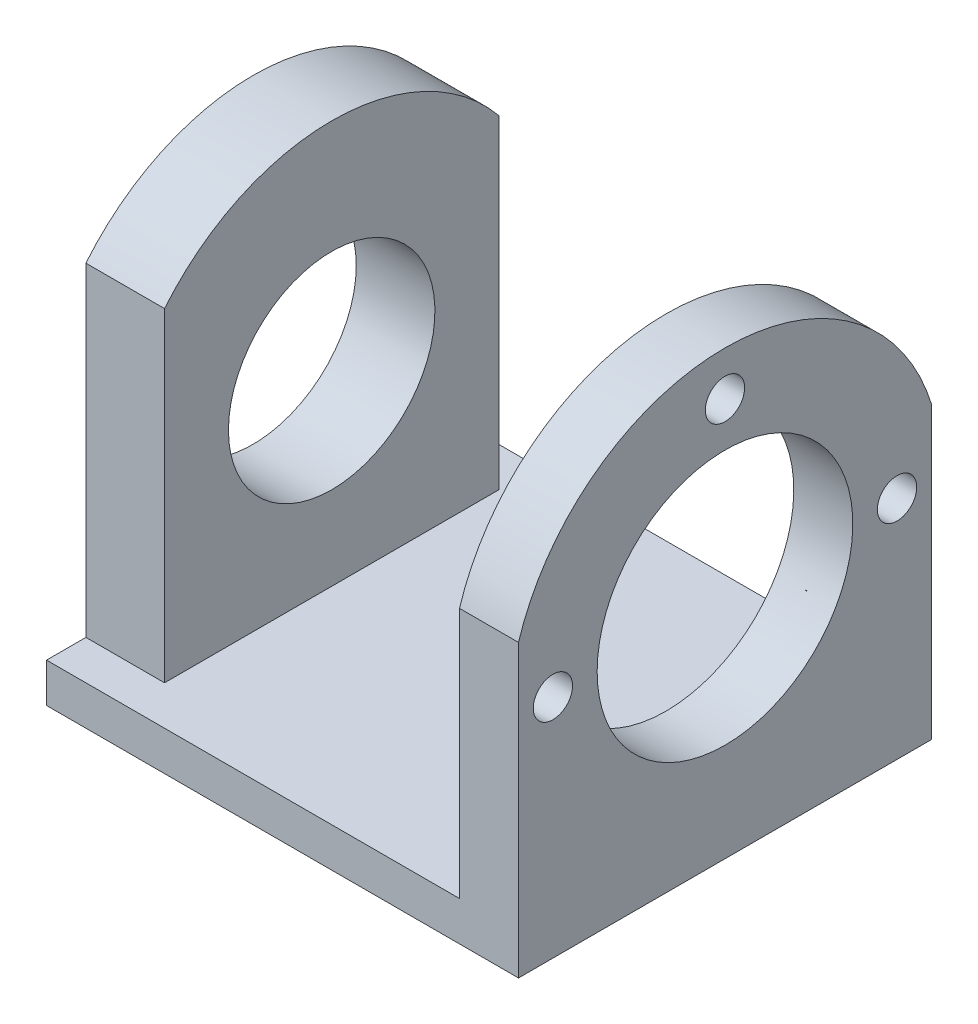
ISO-10303-21;
HEADER;
FILE_DESCRIPTION(('STEP AP214'),'2;1');
FILE_NAME('part.step','',(''),(''),'','','');
FILE_SCHEMA(('AUTOMOTIVE_DESIGN { 1 0 10303 214 1 1 1 1 }'));
ENDSEC;
DATA;
#1=APPLICATION_CONTEXT('core data for automotive mechanical design processes');
#2=APPLICATION_PROTOCOL_DEFINITION('international standard','automotive_design',2000,#1);
#3=PRODUCT_CONTEXT('',#1,'mechanical');
#4=PRODUCT('Part','Part','',(#3));
#5=PRODUCT_RELATED_PRODUCT_CATEGORY('part','',(#4));
#6=PRODUCT_DEFINITION_FORMATION('','',#4);
#7=PRODUCT_DEFINITION_CONTEXT('part definition',#1,'design');
#8=PRODUCT_DEFINITION('design','',#6,#7);
#9=PRODUCT_DEFINITION_SHAPE('','',#8);
#10=(LENGTH_UNIT() NAMED_UNIT(*) SI_UNIT(.MILLI.,.METRE.));
#11=(NAMED_UNIT(*) PLANE_ANGLE_UNIT() SI_UNIT($,.RADIAN.));
#12=(NAMED_UNIT(*) SI_UNIT($,.STERADIAN.) SOLID_ANGLE_UNIT());
#13=UNCERTAINTY_MEASURE_WITH_UNIT(LENGTH_MEASURE(1.E-05),#10,'distance_accuracy_value','');
#14=(GEOMETRIC_REPRESENTATION_CONTEXT(3) GLOBAL_UNCERTAINTY_ASSIGNED_CONTEXT((#13)) GLOBAL_UNIT_ASSIGNED_CONTEXT((#10,
#11,#12)) REPRESENTATION_CONTEXT('',''));
#15=CARTESIAN_POINT('',(0.,0.,0.));
#16=DIRECTION('',(0.,0.,1.));
#17=DIRECTION('',(1.,0.,0.));
#18=AXIS2_PLACEMENT_3D('',#15,#16,#17);
#19=CARTESIAN_POINT('',(24.,45.,-21.));
#20=DIRECTION('',(-1.,0.,0.));
#21=DIRECTION('',(0.,0.,1.));
#22=AXIS2_PLACEMENT_3D('',#19,#20,#21);
#23=PLANE('',#22);
#24=CARTESIAN_POINT('',(24.,23.,17.5));
#25=DIRECTION('',(1.,0.,0.));
#26=DIRECTION('',(0.,0.,-1.));
#27=AXIS2_PLACEMENT_3D('',#24,#25,#26);
#28=CIRCLE('',#27,2.);
#29=CARTESIAN_POINT('',(24.,23.,15.5));
#30=VERTEX_POINT('',#29);
#31=EDGE_CURVE('E248',#30,#30,#28,.T.);
#32=ORIENTED_EDGE('',*,*,#31,.F.);
#33=EDGE_LOOP('',(#32));
#34=FACE_BOUND('',#33,.T.);
#35=CARTESIAN_POINT('',(24.,40.5,0.));
#36=DIRECTION('',(1.,0.,0.));
#37=DIRECTION('',(0.,0.,-1.));
#38=AXIS2_PLACEMENT_3D('',#35,#36,#37);
#39=CIRCLE('',#38,2.);
#40=CARTESIAN_POINT('',(24.,40.5,-2.));
#41=VERTEX_POINT('',#40);
#42=EDGE_CURVE('E249',#41,#41,#39,.T.);
#43=ORIENTED_EDGE('',*,*,#42,.F.);
#44=EDGE_LOOP('',(#43));
#45=FACE_BOUND('',#44,.T.);
#46=CARTESIAN_POINT('',(24.,23.,-17.5));
#47=DIRECTION('',(1.,0.,0.));
#48=DIRECTION('',(0.,0.,-1.));
#49=AXIS2_PLACEMENT_3D('',#46,#47,#48);
#50=CIRCLE('',#49,2.);
#51=CARTESIAN_POINT('',(24.,23.,-19.5));
#52=VERTEX_POINT('',#51);
#53=EDGE_CURVE('E242',#52,#52,#50,.T.);
#54=ORIENTED_EDGE('',*,*,#53,.F.);
#55=EDGE_LOOP('',(#54));
#56=FACE_BOUND('',#55,.T.);
#57=CARTESIAN_POINT('',(24.,23.,0.));
#58=DIRECTION('',(-1.,0.,0.));
#59=DIRECTION('',(0.,0.,1.));
#60=AXIS2_PLACEMENT_3D('',#57,#58,#59);
#61=CIRCLE('',#60,13.);
#62=CARTESIAN_POINT('',(24.,23.,13.));
#63=VERTEX_POINT('',#62);
#64=EDGE_CURVE('E236',#63,#63,#61,.F.);
#65=ORIENTED_EDGE('',*,*,#64,.F.);
#66=EDGE_LOOP('',(#65));
#67=FACE_BOUND('',#66,.T.);
#68=DIRECTION('',(0.,-1.,0.));
#69=VECTOR('',#68,1.);
#70=CARTESIAN_POINT('',(24.,45.,-21.));
#71=LINE('',#70,#69);
#72=CARTESIAN_POINT('',(24.,29.557438524302,-21.));
#73=VERTEX_POINT('',#72);
#74=CARTESIAN_POINT('',(24.,0.,-21.));
#75=VERTEX_POINT('',#74);
#76=EDGE_CURVE('E193',#73,#75,#71,.T.);
#77=ORIENTED_EDGE('',*,*,#76,.F.);
#78=CARTESIAN_POINT('',(24.,23.,0.));
#79=DIRECTION('',(-1.,0.,0.));
#80=DIRECTION('',(0.,0.,1.));
#81=AXIS2_PLACEMENT_3D('',#78,#79,#80);
#82=CIRCLE('',#81,22.);
#83=CARTESIAN_POINT('',(24.,29.557438524302,21.));
#84=VERTEX_POINT('',#83);
#85=EDGE_CURVE('E265',#84,#73,#82,.T.);
#86=ORIENTED_EDGE('',*,*,#85,.F.);
#87=DIRECTION('',(0.,-1.,0.));
#88=VECTOR('',#87,1.);
#89=CARTESIAN_POINT('',(24.,45.,21.));
#90=LINE('',#89,#88);
#91=CARTESIAN_POINT('',(24.,0.,21.));
#92=VERTEX_POINT('',#91);
#93=EDGE_CURVE('E199',#84,#92,#90,.T.);
#94=ORIENTED_EDGE('',*,*,#93,.T.);
#95=DIRECTION('',(0.,0.,-1.));
#96=VECTOR('',#95,1.);
#97=CARTESIAN_POINT('',(24.,0.,-21.));
#98=LINE('',#97,#96);
#99=EDGE_CURVE('E210',#92,#75,#98,.T.);
#100=ORIENTED_EDGE('',*,*,#99,.T.);
#101=EDGE_LOOP('',(#77,#86,#94,#100));
#102=FACE_BOUND('',#101,.T.);
#103=ADVANCED_FACE('F40',(#34,#45,#56,#67,#102),#23,.F.);
#104=CARTESIAN_POINT('',(-24.,45.,-21.));
#105=DIRECTION('',(1.,0.,0.));
#106=DIRECTION('',(0.,0.,-1.));
#107=AXIS2_PLACEMENT_3D('',#104,#105,#106);
#108=PLANE('',#107);
#109=CARTESIAN_POINT('',(-24.,23.,0.));
#110=DIRECTION('',(-1.,0.,0.));
#111=DIRECTION('',(0.,0.,1.));
#112=AXIS2_PLACEMENT_3D('',#109,#110,#111);
#113=CIRCLE('',#112,10.5);
#114=CARTESIAN_POINT('',(-24.,23.,10.5));
#115=VERTEX_POINT('',#114);
#116=EDGE_CURVE('E233',#115,#115,#113,.T.);
#117=ORIENTED_EDGE('',*,*,#116,.F.);
#118=EDGE_LOOP('',(#117));
#119=FACE_BOUND('',#118,.T.);
#120=DIRECTION('',(0.,-1.,0.));
#121=VECTOR('',#120,1.);
#122=CARTESIAN_POINT('',(-24.,45.,21.));
#123=LINE('',#122,#121);
#124=CARTESIAN_POINT('',(-24.,4.,21.));
#125=VERTEX_POINT('',#124);
#126=CARTESIAN_POINT('',(-24.,0.,21.));
#127=VERTEX_POINT('',#126);
#128=EDGE_CURVE('E197',#125,#127,#123,.T.);
#129=ORIENTED_EDGE('',*,*,#128,.F.);
#130=DIRECTION('',(0.,0.,1.));
#131=VECTOR('',#130,1.);
#132=CARTESIAN_POINT('',(-24.,4.,17.));
#133=LINE('',#132,#131);
#134=CARTESIAN_POINT('',(-24.,4.,17.));
#135=VERTEX_POINT('',#134);
#136=EDGE_CURVE('E295',#135,#125,#133,.T.);
#137=ORIENTED_EDGE('',*,*,#136,.F.);
#138=DIRECTION('',(0.,-1.,0.));
#139=VECTOR('',#138,1.);
#140=CARTESIAN_POINT('',(-24.,36.9642400437689,17.));
#141=LINE('',#140,#139);
#142=CARTESIAN_POINT('',(-24.,36.9642400437689,17.));
#143=VERTEX_POINT('',#142);
#144=EDGE_CURVE('E292',#143,#135,#141,.T.);
#145=ORIENTED_EDGE('',*,*,#144,.F.);
#146=CARTESIAN_POINT('',(-24.,23.,0.));
#147=DIRECTION('',(-1.,0.,0.));
#148=DIRECTION('',(0.,0.,1.));
#149=AXIS2_PLACEMENT_3D('',#146,#147,#148);
#150=CIRCLE('',#149,22.);
#151=CARTESIAN_POINT('',(-24.,36.9642400437689,-17.));
#152=VERTEX_POINT('',#151);
#153=EDGE_CURVE('E266',#143,#152,#150,.T.);
#154=ORIENTED_EDGE('',*,*,#153,.T.);
#155=DIRECTION('',(0.,1.,0.));
#156=VECTOR('',#155,1.);
#157=CARTESIAN_POINT('',(-24.,36.9642400437689,-17.));
#158=LINE('',#157,#156);
#159=CARTESIAN_POINT('',(-24.,4.,-17.));
#160=VERTEX_POINT('',#159);
#161=EDGE_CURVE('E272',#160,#152,#158,.T.);
#162=ORIENTED_EDGE('',*,*,#161,.F.);
#163=DIRECTION('',(0.,0.,1.));
#164=VECTOR('',#163,1.);
#165=CARTESIAN_POINT('',(-24.,4.,-17.));
#166=LINE('',#165,#164);
#167=CARTESIAN_POINT('',(-24.,4.,-21.));
#168=VERTEX_POINT('',#167);
#169=EDGE_CURVE('E275',#168,#160,#166,.T.);
#170=ORIENTED_EDGE('',*,*,#169,.F.);
#171=DIRECTION('',(0.,-1.,0.));
#172=VECTOR('',#171,1.);
#173=CARTESIAN_POINT('',(-24.,45.,-21.));
#174=LINE('',#173,#172);
#175=CARTESIAN_POINT('',(-24.,0.,-21.));
#176=VERTEX_POINT('',#175);
#177=EDGE_CURVE('E195',#168,#176,#174,.T.);
#178=ORIENTED_EDGE('',*,*,#177,.T.);
#179=DIRECTION('',(0.,0.,1.));
#180=VECTOR('',#179,1.);
#181=CARTESIAN_POINT('',(-24.,0.,-21.));
#182=LINE('',#181,#180);
#183=EDGE_CURVE('E204',#176,#127,#182,.T.);
#184=ORIENTED_EDGE('',*,*,#183,.T.);
#185=EDGE_LOOP('',(#129,#137,#145,#154,#162,#170,#178,#184));
#186=FACE_BOUND('',#185,.T.);
#187=ADVANCED_FACE('F341',(#119,#186),#108,.F.);
#188=CARTESIAN_POINT('',(-16.,45.,-21.));
#189=DIRECTION('',(-1.,0.,0.));
#190=DIRECTION('',(0.,-1.,0.));
#191=AXIS2_PLACEMENT_3D('',#188,#189,#190);
#192=PLANE('',#191);
#193=CARTESIAN_POINT('',(-16.,23.,0.));
#194=DIRECTION('',(-1.,0.,0.));
#195=DIRECTION('',(0.,-1.,0.));
#196=AXIS2_PLACEMENT_3D('',#193,#194,#195);
#197=CIRCLE('',#196,10.5);
#198=CARTESIAN_POINT('',(-16.,12.5,0.));
#199=VERTEX_POINT('',#198);
#200=EDGE_CURVE('E230',#199,#199,#197,.F.);
#201=ORIENTED_EDGE('',*,*,#200,.F.);
#202=EDGE_LOOP('',(#201));
#203=FACE_BOUND('',#202,.T.);
#204=CARTESIAN_POINT('',(-16.,23.,0.));
#205=DIRECTION('',(-1.,0.,0.));
#206=DIRECTION('',(0.,-1.,0.));
#207=AXIS2_PLACEMENT_3D('',#204,#205,#206);
#208=CIRCLE('',#207,22.);
#209=CARTESIAN_POINT('',(-16.,36.9642400437689,17.));
#210=VERTEX_POINT('',#209);
#211=CARTESIAN_POINT('',(-16.,36.9642400437689,-17.));
#212=VERTEX_POINT('',#211);
#213=EDGE_CURVE('E256',#210,#212,#208,.T.);
#214=ORIENTED_EDGE('',*,*,#213,.F.);
#215=DIRECTION('',(0.,1.,0.));
#216=VECTOR('',#215,1.);
#217=CARTESIAN_POINT('',(-16.,36.9642400437689,17.));
#218=LINE('',#217,#216);
#219=CARTESIAN_POINT('',(-16.,4.,17.));
#220=VERTEX_POINT('',#219);
#221=EDGE_CURVE('E282',#220,#210,#218,.T.);
#222=ORIENTED_EDGE('',*,*,#221,.F.);
#223=DIRECTION('',(0.,0.,1.));
#224=VECTOR('',#223,1.);
#225=CARTESIAN_POINT('',(-16.,4.,-21.));
#226=LINE('',#225,#224);
#227=CARTESIAN_POINT('',(-16.,4.,-17.));
#228=VERTEX_POINT('',#227);
#229=EDGE_CURVE('E214',#228,#220,#226,.T.);
#230=ORIENTED_EDGE('',*,*,#229,.F.);
#231=DIRECTION('',(0.,-1.,0.));
#232=VECTOR('',#231,1.);
#233=CARTESIAN_POINT('',(-16.,36.9642400437689,-17.));
#234=LINE('',#233,#232);
#235=EDGE_CURVE('E279',#212,#228,#234,.T.);
#236=ORIENTED_EDGE('',*,*,#235,.F.);
#237=EDGE_LOOP('',(#214,#222,#230,#236));
#238=FACE_BOUND('',#237,.T.);
#239=ADVANCED_FACE('F367',(#203,#238),#192,.F.);
#240=CARTESIAN_POINT('',(18.,45.,-21.));
#241=DIRECTION('',(1.,0.,0.));
#242=DIRECTION('',(0.,1.,0.));
#243=AXIS2_PLACEMENT_3D('',#240,#241,#242);
#244=PLANE('',#243);
#245=CARTESIAN_POINT('',(18.,23.,17.5));
#246=DIRECTION('',(1.,0.,0.));
#247=DIRECTION('',(0.,1.,0.));
#248=AXIS2_PLACEMENT_3D('',#245,#246,#247);
#249=CIRCLE('',#248,2.);
#250=CARTESIAN_POINT('',(18.,25.,17.5));
#251=VERTEX_POINT('',#250);
#252=EDGE_CURVE('E252',#251,#251,#249,.F.);
#253=ORIENTED_EDGE('',*,*,#252,.F.);
#254=EDGE_LOOP('',(#253));
#255=FACE_BOUND('',#254,.T.);
#256=CARTESIAN_POINT('',(18.,40.5,0.));
#257=DIRECTION('',(1.,0.,0.));
#258=DIRECTION('',(0.,1.,0.));
#259=AXIS2_PLACEMENT_3D('',#256,#257,#258);
#260=CIRCLE('',#259,2.);
#261=CARTESIAN_POINT('',(18.,42.5,0.));
#262=VERTEX_POINT('',#261);
#263=EDGE_CURVE('E253',#262,#262,#260,.F.);
#264=ORIENTED_EDGE('',*,*,#263,.F.);
#265=EDGE_LOOP('',(#264));
#266=FACE_BOUND('',#265,.T.);
#267=CARTESIAN_POINT('',(18.,23.,-17.5));
#268=DIRECTION('',(1.,0.,0.));
#269=DIRECTION('',(0.,1.,0.));
#270=AXIS2_PLACEMENT_3D('',#267,#268,#269);
#271=CIRCLE('',#270,2.);
#272=CARTESIAN_POINT('',(18.,25.,-17.5));
#273=VERTEX_POINT('',#272);
#274=EDGE_CURVE('E245',#273,#273,#271,.F.);
#275=ORIENTED_EDGE('',*,*,#274,.F.);
#276=EDGE_LOOP('',(#275));
#277=FACE_BOUND('',#276,.T.);
#278=CARTESIAN_POINT('',(18.,23.,0.));
#279=DIRECTION('',(-1.,0.,0.));
#280=DIRECTION('',(0.,-1.,0.));
#281=AXIS2_PLACEMENT_3D('',#278,#279,#280);
#282=CIRCLE('',#281,13.);
#283=CARTESIAN_POINT('',(18.,10.,0.));
#284=VERTEX_POINT('',#283);
#285=EDGE_CURVE('E239',#284,#284,#282,.T.);
#286=ORIENTED_EDGE('',*,*,#285,.F.);
#287=EDGE_LOOP('',(#286));
#288=FACE_BOUND('',#287,.T.);
#289=CARTESIAN_POINT('',(18.,23.,0.));
#290=DIRECTION('',(1.,0.,0.));
#291=DIRECTION('',(0.,1.,0.));
#292=AXIS2_PLACEMENT_3D('',#289,#290,#291);
#293=CIRCLE('',#292,22.);
#294=CARTESIAN_POINT('',(18.,29.557438524302,-21.));
#295=VERTEX_POINT('',#294);
#296=CARTESIAN_POINT('',(18.,29.557438524302,21.));
#297=VERTEX_POINT('',#296);
#298=EDGE_CURVE('E191',#295,#297,#293,.T.);
#299=ORIENTED_EDGE('',*,*,#298,.F.);
#300=DIRECTION('',(0.,1.,0.));
#301=VECTOR('',#300,1.);
#302=CARTESIAN_POINT('',(18.,45.,-21.));
#303=LINE('',#302,#301);
#304=CARTESIAN_POINT('',(18.,4.,-21.));
#305=VERTEX_POINT('',#304);
#306=EDGE_CURVE('E217',#305,#295,#303,.T.);
#307=ORIENTED_EDGE('',*,*,#306,.F.);
#308=DIRECTION('',(0.,0.,1.));
#309=VECTOR('',#308,1.);
#310=CARTESIAN_POINT('',(18.,4.,-21.));
#311=LINE('',#310,#309);
#312=CARTESIAN_POINT('',(18.,4.,21.));
#313=VERTEX_POINT('',#312);
#314=EDGE_CURVE('E213',#305,#313,#311,.T.);
#315=ORIENTED_EDGE('',*,*,#314,.T.);
#316=DIRECTION('',(0.,1.,0.));
#317=VECTOR('',#316,1.);
#318=CARTESIAN_POINT('',(18.,45.,21.));
#319=LINE('',#318,#317);
#320=EDGE_CURVE('E224',#313,#297,#319,.T.);
#321=ORIENTED_EDGE('',*,*,#320,.T.);
#322=EDGE_LOOP('',(#299,#307,#315,#321));
#323=FACE_BOUND('',#322,.T.);
#324=ADVANCED_FACE('F352',(#255,#266,#277,#288,#323),#244,.F.);
#325=CARTESIAN_POINT('',(-24.,45.,-21.));
#326=DIRECTION('',(0.,0.,1.));
#327=DIRECTION('',(1.,0.,0.));
#328=AXIS2_PLACEMENT_3D('',#325,#326,#327);
#329=PLANE('',#328);
#330=ORIENTED_EDGE('',*,*,#177,.F.);
#331=DIRECTION('',(1.,0.,0.));
#332=VECTOR('',#331,1.);
#333=CARTESIAN_POINT('',(-16.,4.,-21.));
#334=LINE('',#333,#332);
#335=EDGE_CURVE('E221',#168,#305,#334,.T.);
#336=ORIENTED_EDGE('',*,*,#335,.T.);
#337=ORIENTED_EDGE('',*,*,#306,.T.);
#338=DIRECTION('',(-1.,0.,0.));
#339=VECTOR('',#338,1.);
#340=CARTESIAN_POINT('',(24.,29.557438524302,-21.));
#341=LINE('',#340,#339);
#342=EDGE_CURVE('E268',#73,#295,#341,.T.);
#343=ORIENTED_EDGE('',*,*,#342,.F.);
#344=ORIENTED_EDGE('',*,*,#76,.T.);
#345=DIRECTION('',(-1.,0.,0.));
#346=VECTOR('',#345,1.);
#347=CARTESIAN_POINT('',(-24.,0.,-21.));
#348=LINE('',#347,#346);
#349=EDGE_CURVE('E207',#75,#176,#348,.T.);
#350=ORIENTED_EDGE('',*,*,#349,.T.);
#351=EDGE_LOOP('',(#330,#336,#337,#343,#344,#350));
#352=FACE_BOUND('',#351,.T.);
#353=ADVANCED_FACE('F346',(#352),#329,.F.);
#354=CARTESIAN_POINT('',(-24.,45.,21.));
#355=DIRECTION('',(0.,0.,-1.));
#356=DIRECTION('',(-1.,0.,0.));
#357=AXIS2_PLACEMENT_3D('',#354,#355,#356);
#358=PLANE('',#357);
#359=DIRECTION('',(1.,0.,0.));
#360=VECTOR('',#359,1.);
#361=CARTESIAN_POINT('',(-16.,4.,21.));
#362=LINE('',#361,#360);
#363=EDGE_CURVE('E227',#125,#313,#362,.T.);
#364=ORIENTED_EDGE('',*,*,#363,.F.);
#365=ORIENTED_EDGE('',*,*,#128,.T.);
#366=DIRECTION('',(1.,0.,0.));
#367=VECTOR('',#366,1.);
#368=CARTESIAN_POINT('',(-24.,0.,21.));
#369=LINE('',#368,#367);
#370=EDGE_CURVE('E201',#127,#92,#369,.T.);
#371=ORIENTED_EDGE('',*,*,#370,.T.);
#372=ORIENTED_EDGE('',*,*,#93,.F.);
#373=DIRECTION('',(-1.,0.,0.));
#374=VECTOR('',#373,1.);
#375=CARTESIAN_POINT('',(24.,29.557438524302,21.));
#376=LINE('',#375,#374);
#377=EDGE_CURVE('E262',#84,#297,#376,.T.);
#378=ORIENTED_EDGE('',*,*,#377,.T.);
#379=ORIENTED_EDGE('',*,*,#320,.F.);
#380=EDGE_LOOP('',(#364,#365,#371,#372,#378,#379));
#381=FACE_BOUND('',#380,.T.);
#382=ADVANCED_FACE('F320',(#381),#358,.F.);
#383=CARTESIAN_POINT('',(0.,0.,0.));
#384=DIRECTION('',(0.,1.,0.));
#385=DIRECTION('',(0.,0.,1.));
#386=AXIS2_PLACEMENT_3D('',#383,#384,#385);
#387=PLANE('',#386);
#388=CARTESIAN_POINT('',(21.,0.,-12.5));
#389=DIRECTION('',(0.,-1.,0.));
#390=DIRECTION('',(0.,0.,-1.));
#391=AXIS2_PLACEMENT_3D('',#388,#389,#390);
#392=CIRCLE('',#391,1.24999999999999);
#393=CARTESIAN_POINT('',(21.,0.,-13.75));
#394=VERTEX_POINT('',#393);
#395=EDGE_CURVE('E151',#394,#394,#392,.T.);
#396=ORIENTED_EDGE('',*,*,#395,.F.);
#397=EDGE_LOOP('',(#396));
#398=FACE_BOUND('',#397,.T.);
#399=CARTESIAN_POINT('',(21.,0.,12.5));
#400=DIRECTION('',(0.,-1.,0.));
#401=DIRECTION('',(0.,0.,-1.));
#402=AXIS2_PLACEMENT_3D('',#399,#400,#401);
#403=CIRCLE('',#402,1.24999999999999);
#404=CARTESIAN_POINT('',(21.,0.,11.25));
#405=VERTEX_POINT('',#404);
#406=EDGE_CURVE('E150',#405,#405,#403,.T.);
#407=ORIENTED_EDGE('',*,*,#406,.F.);
#408=EDGE_LOOP('',(#407));
#409=FACE_BOUND('',#408,.T.);
#410=CARTESIAN_POINT('',(-21.,0.,12.5));
#411=DIRECTION('',(0.,-1.,0.));
#412=DIRECTION('',(0.,0.,-1.));
#413=AXIS2_PLACEMENT_3D('',#410,#411,#412);
#414=CIRCLE('',#413,1.24999999999999);
#415=CARTESIAN_POINT('',(-21.,0.,11.25));
#416=VERTEX_POINT('',#415);
#417=EDGE_CURVE('E307',#416,#416,#414,.T.);
#418=ORIENTED_EDGE('',*,*,#417,.F.);
#419=EDGE_LOOP('',(#418));
#420=FACE_BOUND('',#419,.T.);
#421=CARTESIAN_POINT('',(-21.,0.,-12.5));
#422=DIRECTION('',(0.,-1.,0.));
#423=DIRECTION('',(0.,0.,-1.));
#424=AXIS2_PLACEMENT_3D('',#421,#422,#423);
#425=CIRCLE('',#424,1.24999999999999);
#426=CARTESIAN_POINT('',(-21.,0.,-13.75));
#427=VERTEX_POINT('',#426);
#428=EDGE_CURVE('E301',#427,#427,#425,.T.);
#429=ORIENTED_EDGE('',*,*,#428,.F.);
#430=EDGE_LOOP('',(#429));
#431=FACE_BOUND('',#430,.T.);
#432=ORIENTED_EDGE('',*,*,#99,.F.);
#433=ORIENTED_EDGE('',*,*,#370,.F.);
#434=ORIENTED_EDGE('',*,*,#183,.F.);
#435=ORIENTED_EDGE('',*,*,#349,.F.);
#436=EDGE_LOOP('',(#432,#433,#434,#435));
#437=FACE_BOUND('',#436,.T.);
#438=ADVANCED_FACE('F316',(#398,#409,#420,#431,#437),#387,.F.);
#439=CARTESIAN_POINT('',(-16.,4.,-21.));
#440=DIRECTION('',(0.,-1.,0.));
#441=DIRECTION('',(0.,0.,-1.));
#442=AXIS2_PLACEMENT_3D('',#439,#440,#441);
#443=PLANE('',#442);
#444=ORIENTED_EDGE('',*,*,#314,.F.);
#445=ORIENTED_EDGE('',*,*,#335,.F.);
#446=ORIENTED_EDGE('',*,*,#169,.T.);
#447=DIRECTION('',(-1.,0.,0.));
#448=VECTOR('',#447,1.);
#449=CARTESIAN_POINT('',(24.001,4.,-17.));
#450=LINE('',#449,#448);
#451=EDGE_CURVE('E273',#228,#160,#450,.T.);
#452=ORIENTED_EDGE('',*,*,#451,.F.);
#453=ORIENTED_EDGE('',*,*,#229,.T.);
#454=DIRECTION('',(-1.,0.,0.));
#455=VECTOR('',#454,1.);
#456=CARTESIAN_POINT('',(24.001,4.,17.));
#457=LINE('',#456,#455);
#458=EDGE_CURVE('E289',#220,#135,#457,.T.);
#459=ORIENTED_EDGE('',*,*,#458,.T.);
#460=ORIENTED_EDGE('',*,*,#136,.T.);
#461=ORIENTED_EDGE('',*,*,#363,.T.);
#462=EDGE_LOOP('',(#444,#445,#446,#452,#453,#459,#460,#461));
#463=FACE_BOUND('',#462,.T.);
#464=ADVANCED_FACE('F319',(#463),#443,.F.);
#465=CARTESIAN_POINT('',(24.001,23.,0.));
#466=DIRECTION('',(-1.,0.,0.));
#467=DIRECTION('',(0.,0.,1.));
#468=AXIS2_PLACEMENT_3D('',#465,#466,#467);
#469=CYLINDRICAL_SURFACE('',#468,10.5);
#470=ORIENTED_EDGE('',*,*,#116,.T.);
#471=EDGE_LOOP('',(#470));
#472=FACE_BOUND('',#471,.T.);
#473=ORIENTED_EDGE('',*,*,#200,.T.);
#474=EDGE_LOOP('',(#473));
#475=FACE_BOUND('',#474,.T.);
#476=ADVANCED_FACE('F398',(#472,#475),#469,.F.);
#477=CARTESIAN_POINT('',(24.001,23.,0.));
#478=DIRECTION('',(-1.,0.,0.));
#479=DIRECTION('',(0.,-1.,0.));
#480=AXIS2_PLACEMENT_3D('',#477,#478,#479);
#481=CYLINDRICAL_SURFACE('',#480,13.);
#482=CARTESIAN_POINT('',(21.1440702257322,16.5,-11.2583302491977));
#483=CARTESIAN_POINT('',(21.1264449353295,16.4964572733055,-11.2562847387527));
#484=CARTESIAN_POINT('',(21.1086549450874,16.49354686284,-11.2546023729517));
#485=CARTESIAN_POINT('',(21.0728550091411,16.4890397257972,-11.2519955061193));
#486=CARTESIAN_POINT('',(21.0548450637002,16.4874429976474,-11.2510710041808));
#487=CARTESIAN_POINT('',(21.0013698300561,16.4847334074745,-11.249502778751));
#488=CARTESIAN_POINT('',(20.9657474406884,16.4855570290319,-11.249980871115));
#489=CARTESIAN_POINT('',(20.9053819787434,16.491339217784,-11.2533251609986));
#490=CARTESIAN_POINT('',(20.880468668972,16.4950346289037,-11.2554616311));
#491=CARTESIAN_POINT('',(20.8559297742678,16.4999999999999,-11.2583302491977));
#492=B_SPLINE_CURVE_WITH_KNOTS('',3,(#482,#483,#484,#485,#486,#487,#488,#489,#490,#491),
.UNSPECIFIED.,.F.,.F.,(4,2,2,2,4),(0.,0.0542553012119497,0.108510537481054,0.214857333557874,
0.290484503193122),.UNSPECIFIED.);
#493=CARTESIAN_POINT('',(21.1440702257322,16.5,-11.2583302491977));
#494=VERTEX_POINT('',#493);
#495=CARTESIAN_POINT('',(20.8559297742678,16.5,-11.2583302491977));
#496=VERTEX_POINT('',#495);
#497=EDGE_CURVE('E53',#494,#496,#492,.T.);
#498=ORIENTED_EDGE('',*,*,#497,.T.);
#499=CARTESIAN_POINT('',(20.5110553233349,16.4246924226216,-11.214514267808));
#500=CARTESIAN_POINT('',(20.5517743093166,16.4376613359451,-11.2221184756689));
#501=CARTESIAN_POINT('',(20.593025628653,16.4495541589397,-11.2290608115165));
#502=CARTESIAN_POINT('',(20.6766340471769,16.4705440603449,-11.2412789590578));
#503=CARTESIAN_POINT('',(20.7189947188609,16.4796304660208,-11.2465484108816));
#504=CARTESIAN_POINT('',(20.8029573387293,16.4939830329885,-11.2548572057276));
#505=CARTESIAN_POINT('',(20.8445285285515,16.4993792080562,-11.2579724942906));
#506=CARTESIAN_POINT('',(20.928027193329,16.5063726189817,-11.2620078450729));
#507=CARTESIAN_POINT('',(20.9699538426075,16.5079770435186,-11.2629320612987));
#508=CARTESIAN_POINT('',(21.0518568646211,16.5072568929516,-11.2625168869795));
#509=CARTESIAN_POINT('',(21.0918354733516,16.505107161015,-11.2612782287647));
#510=CARTESIAN_POINT('',(21.1714146019775,16.4974119357332,-11.2568364834548));
#511=CARTESIAN_POINT('',(21.2110143442681,16.4918605488489,-11.2536299869654));
#512=CARTESIAN_POINT('',(21.2909431952677,16.4775568389891,-11.2453459184455));
#513=CARTESIAN_POINT('',(21.3312448706111,16.468693418207,-11.2402033522989));
#514=CARTESIAN_POINT('',(21.4108363932041,16.4484373689691,-11.2284088246116));
#515=CARTESIAN_POINT('',(21.4501293018167,16.4370537498787,-11.2217622379128));
#516=CARTESIAN_POINT('',(21.4889446766651,16.4246924226216,-11.214514267808));
#517=B_SPLINE_CURVE_WITH_KNOTS('',3,(#499,#500,#501,#502,#503,#504,#505,#506,#507,#508,#509,
#510,#511,#512,#513,#514,#515,#516),.UNSPECIFIED.,.F.,.F.,(4,2,2,2,2,2,2,2,4),(0.,
0.13029050793899,0.261070573969153,0.386965863469573,0.512622279283609,0.632581414468707,
0.752748974884479,0.877374065094779,1.00156063209005),.UNSPECIFIED.);
#518=EDGE_CURVE('E11',#496,#494,#517,.T.);
#519=ORIENTED_EDGE('',*,*,#518,.T.);
#520=EDGE_LOOP('',(#498,#519));
#521=FACE_BOUND('',#520,.T.);
#522=CARTESIAN_POINT('',(20.8559297742678,16.5,11.2583302491977));
#523=CARTESIAN_POINT('',(20.8735550646705,16.4964572733055,11.2562847387527));
#524=CARTESIAN_POINT('',(20.8913450549126,16.49354686284,11.2546023729517));
#525=CARTESIAN_POINT('',(20.9271449908589,16.4890397257972,11.2519955061193));
#526=CARTESIAN_POINT('',(20.9451549362998,16.4874429976474,11.2510710041808));
#527=CARTESIAN_POINT('',(20.9986301699439,16.4847334074745,11.249502778751));
#528=CARTESIAN_POINT('',(21.0342525593116,16.4855570290319,11.249980871115));
#529=CARTESIAN_POINT('',(21.0946180212566,16.491339217784,11.2533251609986));
#530=CARTESIAN_POINT('',(21.119531331028,16.4950346289037,11.2554616311));
#531=CARTESIAN_POINT('',(21.1440702257322,16.4999999999999,11.2583302491977));
#532=B_SPLINE_CURVE_WITH_KNOTS('',3,(#522,#523,#524,#525,#526,#527,#528,#529,#530,#531),
.UNSPECIFIED.,.F.,.F.,(4,2,2,2,4),(0.,0.0542553012119463,0.108510537481054,0.214857333557874,
0.290484503193122),.UNSPECIFIED.);
#533=CARTESIAN_POINT('',(20.8559297742678,16.5,11.2583302491977));
#534=VERTEX_POINT('',#533);
#535=CARTESIAN_POINT('',(21.1440702257322,16.5,11.2583302491977));
#536=VERTEX_POINT('',#535);
#537=EDGE_CURVE('E158',#534,#536,#532,.T.);
#538=ORIENTED_EDGE('',*,*,#537,.T.);
#539=CARTESIAN_POINT('',(21.4889446766651,16.4246924226216,11.214514267808));
#540=CARTESIAN_POINT('',(21.4482256906834,16.4376613359451,11.2221184756689));
#541=CARTESIAN_POINT('',(21.406974371347,16.4495541589397,11.2290608115165));
#542=CARTESIAN_POINT('',(21.3233659528232,16.4705440603449,11.2412789590578));
#543=CARTESIAN_POINT('',(21.2810052811391,16.4796304660208,11.2465484108816));
#544=CARTESIAN_POINT('',(21.1970426612707,16.4939830329885,11.2548572057276));
#545=CARTESIAN_POINT('',(21.1554714714485,16.4993792080562,11.2579724942906));
#546=CARTESIAN_POINT('',(21.071972806671,16.5063726189817,11.2620078450729));
#547=CARTESIAN_POINT('',(21.0300461573925,16.5079770435186,11.2629320612987));
#548=CARTESIAN_POINT('',(20.9481431353789,16.5072568929516,11.2625168869795));
#549=CARTESIAN_POINT('',(20.9081645266484,16.505107161015,11.2612782287647));
#550=CARTESIAN_POINT('',(20.8285853980225,16.4974119357332,11.2568364834548));
#551=CARTESIAN_POINT('',(20.7889856557319,16.4918605488489,11.2536299869654));
#552=CARTESIAN_POINT('',(20.7090568047323,16.4775568389891,11.2453459184455));
#553=CARTESIAN_POINT('',(20.6687551293889,16.468693418207,11.2402033522989));
#554=CARTESIAN_POINT('',(20.5891636067959,16.4484373689691,11.2284088246116));
#555=CARTESIAN_POINT('',(20.5498706981833,16.4370537498787,11.2217622379128));
#556=CARTESIAN_POINT('',(20.5110553233349,16.4246924226216,11.214514267808));
#557=B_SPLINE_CURVE_WITH_KNOTS('',3,(#539,#540,#541,#542,#543,#544,#545,#546,#547,#548,#549,
#550,#551,#552,#553,#554,#555,#556),.UNSPECIFIED.,.F.,.F.,(4,2,2,2,2,2,2,2,4),(0.,
0.130290507938997,0.261070573969158,0.386965863469578,0.512622279283616,0.632581414468711,
0.752748974884483,0.877374065094784,1.00156063209005),.UNSPECIFIED.);
#558=EDGE_CURVE('E156',#536,#534,#557,.T.);
#559=ORIENTED_EDGE('',*,*,#558,.T.);
#560=EDGE_LOOP('',(#538,#559));
#561=FACE_BOUND('',#560,.T.);
#562=ORIENTED_EDGE('',*,*,#285,.T.);
#563=EDGE_LOOP('',(#562));
#564=FACE_BOUND('',#563,.T.);
#565=ORIENTED_EDGE('',*,*,#64,.T.);
#566=EDGE_LOOP('',(#565));
#567=FACE_BOUND('',#566,.T.);
#568=ADVANCED_FACE('F154',(#521,#561,#564,#567),#481,.F.);
#569=CARTESIAN_POINT('',(-24.001,23.,-17.5));
#570=DIRECTION('',(1.,0.,0.));
#571=DIRECTION('',(0.,0.,-1.));
#572=AXIS2_PLACEMENT_3D('',#569,#570,#571);
#573=CYLINDRICAL_SURFACE('',#572,2.);
#574=ORIENTED_EDGE('',*,*,#53,.T.);
#575=EDGE_LOOP('',(#574));
#576=FACE_BOUND('',#575,.T.);
#577=ORIENTED_EDGE('',*,*,#274,.T.);
#578=EDGE_LOOP('',(#577));
#579=FACE_BOUND('',#578,.T.);
#580=ADVANCED_FACE('F397',(#576,#579),#573,.F.);
#581=CARTESIAN_POINT('',(-24.001,40.5,0.));
#582=DIRECTION('',(1.,0.,0.));
#583=DIRECTION('',(0.,0.,-1.));
#584=AXIS2_PLACEMENT_3D('',#581,#582,#583);
#585=CYLINDRICAL_SURFACE('',#584,2.);
#586=ORIENTED_EDGE('',*,*,#42,.T.);
#587=EDGE_LOOP('',(#586));
#588=FACE_BOUND('',#587,.T.);
#589=ORIENTED_EDGE('',*,*,#263,.T.);
#590=EDGE_LOOP('',(#589));
#591=FACE_BOUND('',#590,.T.);
#592=ADVANCED_FACE('F403',(#588,#591),#585,.F.);
#593=CARTESIAN_POINT('',(-24.001,23.,17.5));
#594=DIRECTION('',(1.,0.,0.));
#595=DIRECTION('',(0.,0.,-1.));
#596=AXIS2_PLACEMENT_3D('',#593,#594,#595);
#597=CYLINDRICAL_SURFACE('',#596,2.);
#598=ORIENTED_EDGE('',*,*,#31,.T.);
#599=EDGE_LOOP('',(#598));
#600=FACE_BOUND('',#599,.T.);
#601=ORIENTED_EDGE('',*,*,#252,.T.);
#602=EDGE_LOOP('',(#601));
#603=FACE_BOUND('',#602,.T.);
#604=ADVANCED_FACE('F587',(#600,#603),#597,.F.);
#605=CARTESIAN_POINT('',(24.,23.,0.));
#606=DIRECTION('',(-1.,0.,0.));
#607=DIRECTION('',(0.,0.,1.));
#608=AXIS2_PLACEMENT_3D('',#605,#606,#607);
#609=CYLINDRICAL_SURFACE('',#608,22.);
#610=ORIENTED_EDGE('',*,*,#298,.T.);
#611=ORIENTED_EDGE('',*,*,#377,.F.);
#612=ORIENTED_EDGE('',*,*,#85,.T.);
#613=ORIENTED_EDGE('',*,*,#342,.T.);
#614=EDGE_LOOP('',(#610,#611,#612,#613));
#615=FACE_BOUND('',#614,.T.);
#616=ADVANCED_FACE('F350',(#615),#609,.T.);
#617=DIRECTION('',(-1.,0.,0.));
#618=VECTOR('',#617,1.);
#619=CARTESIAN_POINT('',(24.001,36.9642400437689,17.));
#620=LINE('',#619,#618);
#621=EDGE_CURVE('E287',#210,#143,#620,.T.);
#622=ORIENTED_EDGE('',*,*,#621,.F.);
#623=ORIENTED_EDGE('',*,*,#213,.T.);
#624=DIRECTION('',(-1.,0.,0.));
#625=VECTOR('',#624,1.);
#626=CARTESIAN_POINT('',(24.001,36.9642400437689,-17.));
#627=LINE('',#626,#625);
#628=EDGE_CURVE('E276',#212,#152,#627,.T.);
#629=ORIENTED_EDGE('',*,*,#628,.T.);
#630=ORIENTED_EDGE('',*,*,#153,.F.);
#631=EDGE_LOOP('',(#622,#623,#629,#630));
#632=FACE_BOUND('',#631,.T.);
#633=ADVANCED_FACE('F359',(#632),#609,.T.);
#634=CARTESIAN_POINT('',(24.001,36.9642400437689,-17.));
#635=DIRECTION('',(0.,0.,1.));
#636=DIRECTION('',(1.,0.,0.));
#637=AXIS2_PLACEMENT_3D('',#634,#635,#636);
#638=PLANE('',#637);
#639=ORIENTED_EDGE('',*,*,#235,.T.);
#640=ORIENTED_EDGE('',*,*,#451,.T.);
#641=ORIENTED_EDGE('',*,*,#161,.T.);
#642=ORIENTED_EDGE('',*,*,#628,.F.);
#643=EDGE_LOOP('',(#639,#640,#641,#642));
#644=FACE_BOUND('',#643,.T.);
#645=ADVANCED_FACE('F364',(#644),#638,.F.);
#646=CARTESIAN_POINT('',(24.001,36.9642400437689,17.));
#647=DIRECTION('',(0.,0.,-1.));
#648=DIRECTION('',(-1.,0.,0.));
#649=AXIS2_PLACEMENT_3D('',#646,#647,#648);
#650=PLANE('',#649);
#651=ORIENTED_EDGE('',*,*,#221,.T.);
#652=ORIENTED_EDGE('',*,*,#621,.T.);
#653=ORIENTED_EDGE('',*,*,#144,.T.);
#654=ORIENTED_EDGE('',*,*,#458,.F.);
#655=EDGE_LOOP('',(#651,#652,#653,#654));
#656=FACE_BOUND('',#655,.T.);
#657=ADVANCED_FACE('F369',(#656),#650,.F.);
#658=CARTESIAN_POINT('',(-21.,16.5,-12.5));
#659=DIRECTION('',(0.,-1.,0.));
#660=DIRECTION('',(0.,0.,-1.));
#661=AXIS2_PLACEMENT_3D('',#658,#659,#660);
#662=CONICAL_SURFACE('',#661,1.24999999999999,1.02974425867665);
#663=CARTESIAN_POINT('',(-21.,17.2510757737844,-12.5));
#664=VERTEX_POINT('',#663);
#665=VERTEX_LOOP('',#664);
#666=FACE_BOUND('',#665,.T.);
#667=CARTESIAN_POINT('',(-21.,16.5,-12.5));
#668=DIRECTION('',(0.,-1.,0.));
#669=DIRECTION('',(0.,0.,-1.));
#670=AXIS2_PLACEMENT_3D('',#667,#668,#669);
#671=CIRCLE('',#670,1.24999999999999);
#672=CARTESIAN_POINT('',(-21.,16.5,-13.75));
#673=VERTEX_POINT('',#672);
#674=EDGE_CURVE('E290',#673,#673,#671,.T.);
#675=ORIENTED_EDGE('',*,*,#674,.T.);
#676=EDGE_LOOP('',(#675));
#677=FACE_BOUND('',#676,.T.);
#678=ADVANCED_FACE('F371',(#666,#677),#662,.F.);
#679=CARTESIAN_POINT('',(-21.,0.,-12.5));
#680=DIRECTION('',(0.,-1.,0.));
#681=DIRECTION('',(0.,0.,-1.));
#682=AXIS2_PLACEMENT_3D('',#679,#680,#681);
#683=CYLINDRICAL_SURFACE('',#682,1.24999999999999);
#684=ORIENTED_EDGE('',*,*,#674,.F.);
#685=EDGE_LOOP('',(#684));
#686=FACE_BOUND('',#685,.T.);
#687=ORIENTED_EDGE('',*,*,#428,.T.);
#688=EDGE_LOOP('',(#687));
#689=FACE_BOUND('',#688,.T.);
#690=ADVANCED_FACE('F377',(#686,#689),#683,.F.);
#691=CARTESIAN_POINT('',(-21.,16.5,12.5));
#692=DIRECTION('',(0.,-1.,0.));
#693=DIRECTION('',(0.,0.,-1.));
#694=AXIS2_PLACEMENT_3D('',#691,#692,#693);
#695=CONICAL_SURFACE('',#694,1.24999999999999,1.02974425867665);
#696=CARTESIAN_POINT('',(-21.,17.2510757737844,12.5));
#697=VERTEX_POINT('',#696);
#698=VERTEX_LOOP('',#697);
#699=FACE_BOUND('',#698,.T.);
#700=CARTESIAN_POINT('',(-21.,16.5,12.5));
#701=DIRECTION('',(0.,-1.,0.));
#702=DIRECTION('',(0.,0.,-1.));
#703=AXIS2_PLACEMENT_3D('',#700,#701,#702);
#704=CIRCLE('',#703,1.24999999999999);
#705=CARTESIAN_POINT('',(-21.,16.5,11.25));
#706=VERTEX_POINT('',#705);
#707=EDGE_CURVE('E304',#706,#706,#704,.T.);
#708=ORIENTED_EDGE('',*,*,#707,.T.);
#709=EDGE_LOOP('',(#708));
#710=FACE_BOUND('',#709,.T.);
#711=ADVANCED_FACE('F473',(#699,#710),#695,.F.);
#712=CARTESIAN_POINT('',(-21.,0.,12.5));
#713=DIRECTION('',(0.,-1.,0.));
#714=DIRECTION('',(0.,0.,-1.));
#715=AXIS2_PLACEMENT_3D('',#712,#713,#714);
#716=CYLINDRICAL_SURFACE('',#715,1.24999999999999);
#717=ORIENTED_EDGE('',*,*,#707,.F.);
#718=EDGE_LOOP('',(#717));
#719=FACE_BOUND('',#718,.T.);
#720=ORIENTED_EDGE('',*,*,#417,.T.);
#721=EDGE_LOOP('',(#720));
#722=FACE_BOUND('',#721,.T.);
#723=ADVANCED_FACE('F483',(#719,#722),#716,.F.);
#724=CARTESIAN_POINT('',(21.,16.5,12.5));
#725=DIRECTION('',(0.,-1.,0.));
#726=DIRECTION('',(0.,0.,-1.));
#727=AXIS2_PLACEMENT_3D('',#724,#725,#726);
#728=CONICAL_SURFACE('',#727,1.24999999999999,1.02974425867665);
#729=CARTESIAN_POINT('',(21.,17.2510757737844,12.5));
#730=VERTEX_POINT('',#729);
#731=VERTEX_LOOP('',#730);
#732=FACE_BOUND('',#731,.T.);
#733=CARTESIAN_POINT('',(21.,16.5,12.5));
#734=DIRECTION('',(0.,-1.,0.));
#735=DIRECTION('',(0.,0.,-1.));
#736=AXIS2_PLACEMENT_3D('',#733,#734,#735);
#737=CIRCLE('',#736,1.24999999999999);
#738=EDGE_CURVE('E66',#536,#534,#737,.T.);
#739=ORIENTED_EDGE('',*,*,#738,.T.);
#740=ORIENTED_EDGE('',*,*,#558,.F.);
#741=EDGE_LOOP('',(#739,#740));
#742=FACE_BOUND('',#741,.T.);
#743=ADVANCED_FACE('F181',(#732,#742),#728,.F.);
#744=CARTESIAN_POINT('',(21.,0.,12.5));
#745=DIRECTION('',(0.,-1.,0.));
#746=DIRECTION('',(0.,0.,-1.));
#747=AXIS2_PLACEMENT_3D('',#744,#745,#746);
#748=CYLINDRICAL_SURFACE('',#747,1.24999999999999);
#749=ORIENTED_EDGE('',*,*,#406,.T.);
#750=EDGE_LOOP('',(#749));
#751=FACE_BOUND('',#750,.T.);
#752=ORIENTED_EDGE('',*,*,#738,.F.);
#753=ORIENTED_EDGE('',*,*,#537,.F.);
#754=EDGE_LOOP('',(#752,#753));
#755=FACE_BOUND('',#754,.T.);
#756=ADVANCED_FACE('F148',(#751,#755),#748,.F.);
#757=CARTESIAN_POINT('',(21.,16.5,-12.5));
#758=DIRECTION('',(0.,-1.,0.));
#759=DIRECTION('',(0.,0.,-1.));
#760=AXIS2_PLACEMENT_3D('',#757,#758,#759);
#761=CONICAL_SURFACE('',#760,1.24999999999999,1.02974425867665);
#762=CARTESIAN_POINT('',(21.,17.2510757737844,-12.5));
#763=VERTEX_POINT('',#762);
#764=VERTEX_LOOP('',#763);
#765=FACE_BOUND('',#764,.T.);
#766=CARTESIAN_POINT('',(21.,16.5,-12.5));
#767=DIRECTION('',(0.,-1.,0.));
#768=DIRECTION('',(0.,0.,-1.));
#769=AXIS2_PLACEMENT_3D('',#766,#767,#768);
#770=CIRCLE('',#769,1.24999999999999);
#771=EDGE_CURVE('E59',#496,#494,#770,.T.);
#772=ORIENTED_EDGE('',*,*,#771,.T.);
#773=ORIENTED_EDGE('',*,*,#518,.F.);
#774=EDGE_LOOP('',(#772,#773));
#775=FACE_BOUND('',#774,.T.);
#776=ADVANCED_FACE('F144',(#765,#775),#761,.F.);
#777=CARTESIAN_POINT('',(21.,0.,-12.5));
#778=DIRECTION('',(0.,-1.,0.));
#779=DIRECTION('',(0.,0.,-1.));
#780=AXIS2_PLACEMENT_3D('',#777,#778,#779);
#781=CYLINDRICAL_SURFACE('',#780,1.24999999999999);
#782=ORIENTED_EDGE('',*,*,#395,.T.);
#783=EDGE_LOOP('',(#782));
#784=FACE_BOUND('',#783,.T.);
#785=ORIENTED_EDGE('',*,*,#771,.F.);
#786=ORIENTED_EDGE('',*,*,#497,.F.);
#787=EDGE_LOOP('',(#785,#786));
#788=FACE_BOUND('',#787,.T.);
#789=ADVANCED_FACE('F147',(#784,#788),#781,.F.);
#790=CLOSED_SHELL('',(#103,#187,#239,#324,#353,#382,#438,#464,#476,#568,#580,#592,#604,#616,
#633,#645,#657,#678,#690,#711,#723,#743,#756,#776,#789));
#791=MANIFOLD_SOLID_BREP('B2',#790);
#792=ADVANCED_BREP_SHAPE_REPRESENTATION('',(#18,#791),#14);
#793=SHAPE_DEFINITION_REPRESENTATION(#9,#792);
ENDSEC;
END-ISO-10303-21;
